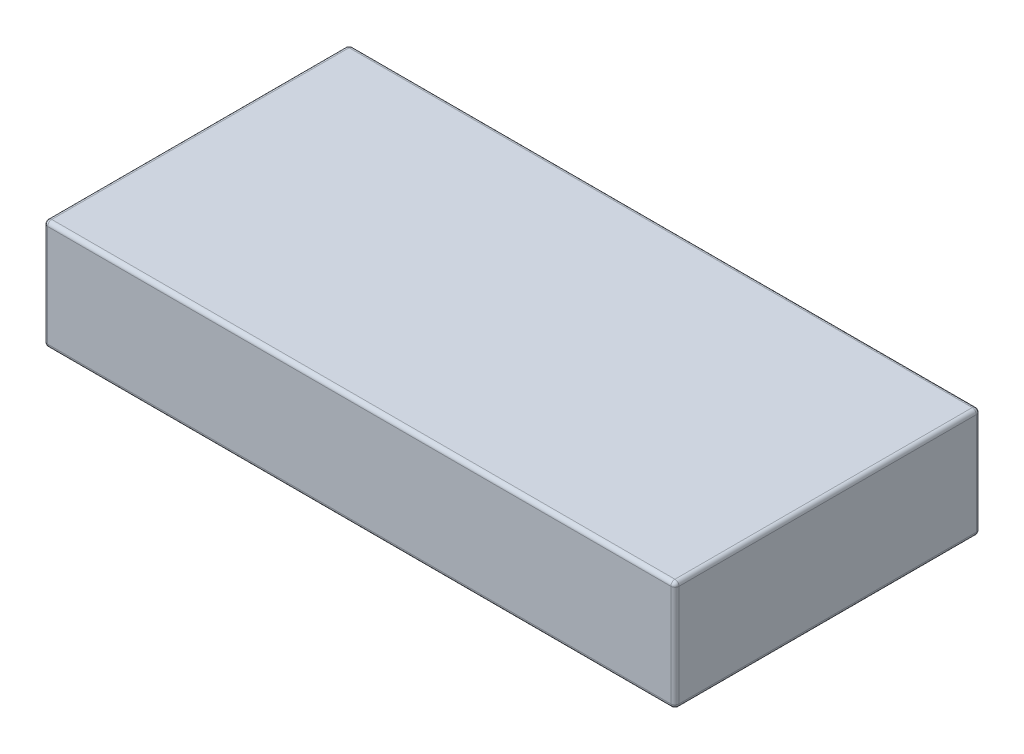
ISO-10303-21;
HEADER;
FILE_DESCRIPTION(('STEP AP214'),'2;1');
FILE_NAME('part.step','',(''),(''),'','','');
FILE_SCHEMA(('AUTOMOTIVE_DESIGN { 1 0 10303 214 1 1 1 1 }'));
ENDSEC;
DATA;
#1=APPLICATION_CONTEXT('core data for automotive mechanical design processes');
#2=APPLICATION_PROTOCOL_DEFINITION('international standard','automotive_design',2000,#1);
#3=PRODUCT_CONTEXT('',#1,'mechanical');
#4=PRODUCT('Part','Part','',(#3));
#5=PRODUCT_RELATED_PRODUCT_CATEGORY('part','',(#4));
#6=PRODUCT_DEFINITION_FORMATION('','',#4);
#7=PRODUCT_DEFINITION_CONTEXT('part definition',#1,'design');
#8=PRODUCT_DEFINITION('design','',#6,#7);
#9=PRODUCT_DEFINITION_SHAPE('','',#8);
#10=(LENGTH_UNIT() NAMED_UNIT(*) SI_UNIT(.MILLI.,.METRE.));
#11=(NAMED_UNIT(*) PLANE_ANGLE_UNIT() SI_UNIT($,.RADIAN.));
#12=(NAMED_UNIT(*) SI_UNIT($,.STERADIAN.) SOLID_ANGLE_UNIT());
#13=UNCERTAINTY_MEASURE_WITH_UNIT(LENGTH_MEASURE(1.E-05),#10,'distance_accuracy_value','');
#14=(GEOMETRIC_REPRESENTATION_CONTEXT(3) GLOBAL_UNCERTAINTY_ASSIGNED_CONTEXT((#13)) GLOBAL_UNIT_ASSIGNED_CONTEXT((#10,
#11,#12)) REPRESENTATION_CONTEXT('',''));
#15=CARTESIAN_POINT('',(0.,0.,0.));
#16=DIRECTION('',(0.,0.,1.));
#17=DIRECTION('',(1.,0.,0.));
#18=AXIS2_PLACEMENT_3D('',#15,#16,#17);
#19=CARTESIAN_POINT('',(77.5,27.,-37.5));
#20=DIRECTION('',(-1.,0.,0.));
#21=DIRECTION('',(0.,0.,1.));
#22=AXIS2_PLACEMENT_3D('',#19,#20,#21);
#23=PLANE('',#22);
#24=DIRECTION('',(0.,-1.,0.));
#25=VECTOR('',#24,1.);
#26=CARTESIAN_POINT('',(77.5,27.,-36.5));
#27=LINE('',#26,#25);
#28=CARTESIAN_POINT('',(77.5,1.,-36.5));
#29=VERTEX_POINT('',#28);
#30=CARTESIAN_POINT('',(77.5,26.,-36.5));
#31=VERTEX_POINT('',#30);
#32=EDGE_CURVE('E140',#29,#31,#27,.F.);
#33=ORIENTED_EDGE('',*,*,#32,.T.);
#34=DIRECTION('',(0.,0.,-1.));
#35=VECTOR('',#34,1.);
#36=CARTESIAN_POINT('',(77.5,26.,37.5));
#37=LINE('',#36,#35);
#38=CARTESIAN_POINT('',(77.5,26.,36.5));
#39=VERTEX_POINT('',#38);
#40=EDGE_CURVE('E186',#31,#39,#37,.F.);
#41=ORIENTED_EDGE('',*,*,#40,.T.);
#42=DIRECTION('',(0.,-1.,0.));
#43=VECTOR('',#42,1.);
#44=CARTESIAN_POINT('',(77.5,27.,36.5));
#45=LINE('',#44,#43);
#46=CARTESIAN_POINT('',(77.5,1.,36.5));
#47=VERTEX_POINT('',#46);
#48=EDGE_CURVE('E181',#39,#47,#45,.T.);
#49=ORIENTED_EDGE('',*,*,#48,.T.);
#50=DIRECTION('',(0.,0.,-1.));
#51=VECTOR('',#50,1.);
#52=CARTESIAN_POINT('',(77.5,1.,-37.5));
#53=LINE('',#52,#51);
#54=EDGE_CURVE('E175',#47,#29,#53,.T.);
#55=ORIENTED_EDGE('',*,*,#54,.T.);
#56=EDGE_LOOP('',(#33,#41,#49,#55));
#57=FACE_BOUND('',#56,.T.);
#58=ADVANCED_FACE('F43',(#57),#23,.F.);
#59=CARTESIAN_POINT('',(-77.5,27.,-37.5));
#60=DIRECTION('',(0.,0.,1.));
#61=DIRECTION('',(1.,0.,0.));
#62=AXIS2_PLACEMENT_3D('',#59,#60,#61);
#63=PLANE('',#62);
#64=DIRECTION('',(0.,-1.,0.));
#65=VECTOR('',#64,1.);
#66=CARTESIAN_POINT('',(-76.5,27.,-37.5));
#67=LINE('',#66,#65);
#68=CARTESIAN_POINT('',(-76.5,1.,-37.5));
#69=VERTEX_POINT('',#68);
#70=CARTESIAN_POINT('',(-76.5,26.,-37.5));
#71=VERTEX_POINT('',#70);
#72=EDGE_CURVE('E165',#69,#71,#67,.F.);
#73=ORIENTED_EDGE('',*,*,#72,.T.);
#74=DIRECTION('',(-1.,0.,0.));
#75=VECTOR('',#74,1.);
#76=CARTESIAN_POINT('',(77.5,26.,-37.5));
#77=LINE('',#76,#75);
#78=CARTESIAN_POINT('',(76.5,26.,-37.5));
#79=VERTEX_POINT('',#78);
#80=EDGE_CURVE('E169',#71,#79,#77,.F.);
#81=ORIENTED_EDGE('',*,*,#80,.T.);
#82=DIRECTION('',(0.,-1.,0.));
#83=VECTOR('',#82,1.);
#84=CARTESIAN_POINT('',(76.5,27.,-37.5));
#85=LINE('',#84,#83);
#86=CARTESIAN_POINT('',(76.5,1.,-37.5));
#87=VERTEX_POINT('',#86);
#88=EDGE_CURVE('E138',#79,#87,#85,.T.);
#89=ORIENTED_EDGE('',*,*,#88,.T.);
#90=DIRECTION('',(-1.,0.,0.));
#91=VECTOR('',#90,1.);
#92=CARTESIAN_POINT('',(-77.5,1.,-37.5));
#93=LINE('',#92,#91);
#94=EDGE_CURVE('E158',#87,#69,#93,.T.);
#95=ORIENTED_EDGE('',*,*,#94,.T.);
#96=EDGE_LOOP('',(#73,#81,#89,#95));
#97=FACE_BOUND('',#96,.T.);
#98=ADVANCED_FACE('F167',(#97),#63,.F.);
#99=CARTESIAN_POINT('',(-77.5,27.,-37.5));
#100=DIRECTION('',(1.,0.,0.));
#101=DIRECTION('',(0.,0.,-1.));
#102=AXIS2_PLACEMENT_3D('',#99,#100,#101);
#103=PLANE('',#102);
#104=DIRECTION('',(0.,-1.,0.));
#105=VECTOR('',#104,1.);
#106=CARTESIAN_POINT('',(-77.5,27.,36.5));
#107=LINE('',#106,#105);
#108=CARTESIAN_POINT('',(-77.5,1.,36.5));
#109=VERTEX_POINT('',#108);
#110=CARTESIAN_POINT('',(-77.5,26.,36.5));
#111=VERTEX_POINT('',#110);
#112=EDGE_CURVE('E192',#109,#111,#107,.F.);
#113=ORIENTED_EDGE('',*,*,#112,.T.);
#114=DIRECTION('',(0.,0.,1.));
#115=VECTOR('',#114,1.);
#116=CARTESIAN_POINT('',(-77.5,26.,-37.5));
#117=LINE('',#116,#115);
#118=CARTESIAN_POINT('',(-77.5,26.,-36.5));
#119=VERTEX_POINT('',#118);
#120=EDGE_CURVE('E199',#111,#119,#117,.F.);
#121=ORIENTED_EDGE('',*,*,#120,.T.);
#122=DIRECTION('',(0.,-1.,0.));
#123=VECTOR('',#122,1.);
#124=CARTESIAN_POINT('',(-77.5,27.,-36.5));
#125=LINE('',#124,#123);
#126=CARTESIAN_POINT('',(-77.5,1.,-36.5));
#127=VERTEX_POINT('',#126);
#128=EDGE_CURVE('E195',#119,#127,#125,.T.);
#129=ORIENTED_EDGE('',*,*,#128,.T.);
#130=DIRECTION('',(0.,0.,1.));
#131=VECTOR('',#130,1.);
#132=CARTESIAN_POINT('',(-77.5,1.,-37.5));
#133=LINE('',#132,#131);
#134=EDGE_CURVE('E189',#127,#109,#133,.T.);
#135=ORIENTED_EDGE('',*,*,#134,.T.);
#136=EDGE_LOOP('',(#113,#121,#129,#135));
#137=FACE_BOUND('',#136,.T.);
#138=ADVANCED_FACE('F338',(#137),#103,.F.);
#139=CARTESIAN_POINT('',(-77.5,27.,37.5));
#140=DIRECTION('',(0.,0.,-1.));
#141=DIRECTION('',(-1.,0.,0.));
#142=AXIS2_PLACEMENT_3D('',#139,#140,#141);
#143=PLANE('',#142);
#144=DIRECTION('',(0.,-1.,0.));
#145=VECTOR('',#144,1.);
#146=CARTESIAN_POINT('',(76.5,27.,37.5));
#147=LINE('',#146,#145);
#148=CARTESIAN_POINT('',(76.5,1.,37.5));
#149=VERTEX_POINT('',#148);
#150=CARTESIAN_POINT('',(76.5,26.,37.5));
#151=VERTEX_POINT('',#150);
#152=EDGE_CURVE('E205',#149,#151,#147,.F.);
#153=ORIENTED_EDGE('',*,*,#152,.T.);
#154=DIRECTION('',(1.,0.,0.));
#155=VECTOR('',#154,1.);
#156=CARTESIAN_POINT('',(-77.5,26.,37.5));
#157=LINE('',#156,#155);
#158=CARTESIAN_POINT('',(-76.5,26.,37.5));
#159=VERTEX_POINT('',#158);
#160=EDGE_CURVE('E212',#151,#159,#157,.F.);
#161=ORIENTED_EDGE('',*,*,#160,.T.);
#162=DIRECTION('',(0.,-1.,0.));
#163=VECTOR('',#162,1.);
#164=CARTESIAN_POINT('',(-76.5,27.,37.5));
#165=LINE('',#164,#163);
#166=CARTESIAN_POINT('',(-76.5,1.,37.5));
#167=VERTEX_POINT('',#166);
#168=EDGE_CURVE('E208',#159,#167,#165,.T.);
#169=ORIENTED_EDGE('',*,*,#168,.T.);
#170=DIRECTION('',(1.,0.,0.));
#171=VECTOR('',#170,1.);
#172=CARTESIAN_POINT('',(-77.5,1.,37.5));
#173=LINE('',#172,#171);
#174=EDGE_CURVE('E202',#167,#149,#173,.T.);
#175=ORIENTED_EDGE('',*,*,#174,.T.);
#176=EDGE_LOOP('',(#153,#161,#169,#175));
#177=FACE_BOUND('',#176,.T.);
#178=ADVANCED_FACE('F349',(#177),#143,.F.);
#179=CARTESIAN_POINT('',(0.,27.,0.));
#180=DIRECTION('',(0.,1.,0.));
#181=DIRECTION('',(0.,0.,1.));
#182=AXIS2_PLACEMENT_3D('',#179,#180,#181);
#183=PLANE('',#182);
#184=DIRECTION('',(0.,0.,1.));
#185=VECTOR('',#184,1.);
#186=CARTESIAN_POINT('',(-76.5,27.,37.5));
#187=LINE('',#186,#185);
#188=CARTESIAN_POINT('',(-76.5,27.,-36.5));
#189=VERTEX_POINT('',#188);
#190=CARTESIAN_POINT('',(-76.5,27.,36.5));
#191=VERTEX_POINT('',#190);
#192=EDGE_CURVE('E221',#189,#191,#187,.T.);
#193=ORIENTED_EDGE('',*,*,#192,.T.);
#194=DIRECTION('',(1.,0.,0.));
#195=VECTOR('',#194,1.);
#196=CARTESIAN_POINT('',(77.5,27.,36.5));
#197=LINE('',#196,#195);
#198=CARTESIAN_POINT('',(76.5,27.,36.5));
#199=VERTEX_POINT('',#198);
#200=EDGE_CURVE('E224',#191,#199,#197,.T.);
#201=ORIENTED_EDGE('',*,*,#200,.T.);
#202=DIRECTION('',(0.,0.,-1.));
#203=VECTOR('',#202,1.);
#204=CARTESIAN_POINT('',(76.5,27.,-37.5));
#205=LINE('',#204,#203);
#206=CARTESIAN_POINT('',(76.5,27.,-36.5));
#207=VERTEX_POINT('',#206);
#208=EDGE_CURVE('E215',#199,#207,#205,.T.);
#209=ORIENTED_EDGE('',*,*,#208,.T.);
#210=DIRECTION('',(-1.,0.,0.));
#211=VECTOR('',#210,1.);
#212=CARTESIAN_POINT('',(-77.5,27.,-36.5));
#213=LINE('',#212,#211);
#214=EDGE_CURVE('E218',#207,#189,#213,.T.);
#215=ORIENTED_EDGE('',*,*,#214,.T.);
#216=EDGE_LOOP('',(#193,#201,#209,#215));
#217=FACE_BOUND('',#216,.T.);
#218=ADVANCED_FACE('F330',(#217),#183,.T.);
#219=CARTESIAN_POINT('',(0.,0.,0.));
#220=DIRECTION('',(0.,1.,0.));
#221=DIRECTION('',(0.,0.,1.));
#222=AXIS2_PLACEMENT_3D('',#219,#220,#221);
#223=PLANE('',#222);
#224=DIRECTION('',(0.,0.,1.));
#225=VECTOR('',#224,1.);
#226=CARTESIAN_POINT('',(-76.5,0.,0.));
#227=LINE('',#226,#225);
#228=CARTESIAN_POINT('',(-76.5,0.,36.5));
#229=VERTEX_POINT('',#228);
#230=CARTESIAN_POINT('',(-76.5,0.,-36.5));
#231=VERTEX_POINT('',#230);
#232=EDGE_CURVE('E53',#229,#231,#227,.F.);
#233=ORIENTED_EDGE('',*,*,#232,.T.);
#234=DIRECTION('',(-1.,0.,0.));
#235=VECTOR('',#234,1.);
#236=CARTESIAN_POINT('',(0.,0.,-36.5));
#237=LINE('',#236,#235);
#238=CARTESIAN_POINT('',(76.5,0.,-36.5));
#239=VERTEX_POINT('',#238);
#240=EDGE_CURVE('E11',#231,#239,#237,.F.);
#241=ORIENTED_EDGE('',*,*,#240,.T.);
#242=DIRECTION('',(0.,0.,-1.));
#243=VECTOR('',#242,1.);
#244=CARTESIAN_POINT('',(76.5,0.,0.));
#245=LINE('',#244,#243);
#246=CARTESIAN_POINT('',(76.5,0.,36.5));
#247=VERTEX_POINT('',#246);
#248=EDGE_CURVE('E228',#239,#247,#245,.F.);
#249=ORIENTED_EDGE('',*,*,#248,.T.);
#250=DIRECTION('',(1.,0.,0.));
#251=VECTOR('',#250,1.);
#252=CARTESIAN_POINT('',(0.,0.,36.5));
#253=LINE('',#252,#251);
#254=EDGE_CURVE('E64',#247,#229,#253,.F.);
#255=ORIENTED_EDGE('',*,*,#254,.T.);
#256=EDGE_LOOP('',(#233,#241,#249,#255));
#257=FACE_BOUND('',#256,.T.);
#258=ADVANCED_FACE('F575',(#257),#223,.F.);
#259=CARTESIAN_POINT('',(-76.5,27.,36.5));
#260=DIRECTION('',(0.,-1.,0.));
#261=DIRECTION('',(0.,0.,-1.));
#262=AXIS2_PLACEMENT_3D('',#259,#260,#261);
#263=CYLINDRICAL_SURFACE('',#262,1.);
#264=CARTESIAN_POINT('',(-76.5,26.,36.5));
#265=DIRECTION('',(0.,1.,0.));
#266=DIRECTION('',(0.,0.,1.));
#267=AXIS2_PLACEMENT_3D('',#264,#265,#266);
#268=CIRCLE('',#267,1.);
#269=EDGE_CURVE('E47',#111,#159,#268,.T.);
#270=ORIENTED_EDGE('',*,*,#269,.F.);
#271=ORIENTED_EDGE('',*,*,#112,.F.);
#272=CARTESIAN_POINT('',(-76.5,1.,36.5));
#273=DIRECTION('',(0.,-1.,0.));
#274=DIRECTION('',(0.,0.,-1.));
#275=AXIS2_PLACEMENT_3D('',#272,#273,#274);
#276=CIRCLE('',#275,1.);
#277=EDGE_CURVE('E305',#167,#109,#276,.T.);
#278=ORIENTED_EDGE('',*,*,#277,.F.);
#279=ORIENTED_EDGE('',*,*,#168,.F.);
#280=EDGE_LOOP('',(#270,#271,#278,#279));
#281=FACE_BOUND('',#280,.T.);
#282=ADVANCED_FACE('F45',(#281),#263,.T.);
#283=CARTESIAN_POINT('',(-76.5,26.,36.5));
#284=DIRECTION('',(0.,0.,1.));
#285=DIRECTION('',(1.,0.,0.));
#286=AXIS2_PLACEMENT_3D('',#283,#284,#285);
#287=SPHERICAL_SURFACE('',#286,1.);
#288=CARTESIAN_POINT('',(-76.5,26.,36.5));
#289=DIRECTION('',(0.,0.,1.));
#290=DIRECTION('',(1.,0.,0.));
#291=AXIS2_PLACEMENT_3D('',#288,#289,#290);
#292=CIRCLE('',#291,1.);
#293=EDGE_CURVE('E298',#111,#191,#292,.F.);
#294=ORIENTED_EDGE('',*,*,#293,.F.);
#295=ORIENTED_EDGE('',*,*,#269,.T.);
#296=CARTESIAN_POINT('',(-76.5,26.,36.5));
#297=DIRECTION('',(-1.,0.,0.));
#298=DIRECTION('',(0.,-1.,0.));
#299=AXIS2_PLACEMENT_3D('',#296,#297,#298);
#300=CIRCLE('',#299,1.);
#301=EDGE_CURVE('E302',#191,#159,#300,.F.);
#302=ORIENTED_EDGE('',*,*,#301,.F.);
#303=EDGE_LOOP('',(#294,#295,#302));
#304=FACE_BOUND('',#303,.T.);
#305=ADVANCED_FACE('F318',(#304),#287,.T.);
#306=CARTESIAN_POINT('',(-76.5,1.,36.5));
#307=DIRECTION('',(-1.,0.,0.));
#308=DIRECTION('',(0.,-1.,0.));
#309=AXIS2_PLACEMENT_3D('',#306,#307,#308);
#310=SPHERICAL_SURFACE('',#309,1.);
#311=CARTESIAN_POINT('',(-76.5,1.,36.5));
#312=DIRECTION('',(-1.,0.,0.));
#313=DIRECTION('',(0.,0.,1.));
#314=AXIS2_PLACEMENT_3D('',#311,#312,#313);
#315=CIRCLE('',#314,1.);
#316=EDGE_CURVE('E291',#167,#229,#315,.F.);
#317=ORIENTED_EDGE('',*,*,#316,.F.);
#318=ORIENTED_EDGE('',*,*,#277,.T.);
#319=CARTESIAN_POINT('',(-76.5,1.,36.5));
#320=DIRECTION('',(0.,0.,1.));
#321=DIRECTION('',(1.,0.,0.));
#322=AXIS2_PLACEMENT_3D('',#319,#320,#321);
#323=CIRCLE('',#322,1.);
#324=EDGE_CURVE('E294',#229,#109,#323,.F.);
#325=ORIENTED_EDGE('',*,*,#324,.F.);
#326=EDGE_LOOP('',(#317,#318,#325));
#327=FACE_BOUND('',#326,.T.);
#328=ADVANCED_FACE('F548',(#327),#310,.T.);
#329=CARTESIAN_POINT('',(0.,26.,36.5));
#330=DIRECTION('',(-1.,0.,0.));
#331=DIRECTION('',(0.,0.,1.));
#332=AXIS2_PLACEMENT_3D('',#329,#330,#331);
#333=CYLINDRICAL_SURFACE('',#332,1.);
#334=ORIENTED_EDGE('',*,*,#301,.T.);
#335=ORIENTED_EDGE('',*,*,#160,.F.);
#336=CARTESIAN_POINT('',(76.5,26.,36.5));
#337=DIRECTION('',(1.,0.,0.));
#338=DIRECTION('',(0.,0.,-1.));
#339=AXIS2_PLACEMENT_3D('',#336,#337,#338);
#340=CIRCLE('',#339,1.);
#341=EDGE_CURVE('E283',#199,#151,#340,.T.);
#342=ORIENTED_EDGE('',*,*,#341,.F.);
#343=ORIENTED_EDGE('',*,*,#200,.F.);
#344=EDGE_LOOP('',(#334,#335,#342,#343));
#345=FACE_BOUND('',#344,.T.);
#346=ADVANCED_FACE('F326',(#345),#333,.T.);
#347=CARTESIAN_POINT('',(-76.5,26.,0.));
#348=DIRECTION('',(0.,0.,-1.));
#349=DIRECTION('',(-1.,0.,0.));
#350=AXIS2_PLACEMENT_3D('',#347,#348,#349);
#351=CYLINDRICAL_SURFACE('',#350,1.);
#352=ORIENTED_EDGE('',*,*,#293,.T.);
#353=ORIENTED_EDGE('',*,*,#192,.F.);
#354=CARTESIAN_POINT('',(-76.5,26.,-36.5));
#355=DIRECTION('',(0.,0.,-1.));
#356=DIRECTION('',(-1.,0.,0.));
#357=AXIS2_PLACEMENT_3D('',#354,#355,#356);
#358=CIRCLE('',#357,1.);
#359=EDGE_CURVE('E279',#119,#189,#358,.T.);
#360=ORIENTED_EDGE('',*,*,#359,.F.);
#361=ORIENTED_EDGE('',*,*,#120,.F.);
#362=EDGE_LOOP('',(#352,#353,#360,#361));
#363=FACE_BOUND('',#362,.T.);
#364=ADVANCED_FACE('F335',(#363),#351,.T.);
#365=CARTESIAN_POINT('',(-76.5,27.,-36.5));
#366=DIRECTION('',(0.,-1.,0.));
#367=DIRECTION('',(0.,0.,-1.));
#368=AXIS2_PLACEMENT_3D('',#365,#366,#367);
#369=CYLINDRICAL_SURFACE('',#368,1.);
#370=CARTESIAN_POINT('',(-76.5,1.,-36.5));
#371=DIRECTION('',(0.,-1.,0.));
#372=DIRECTION('',(0.,0.,-1.));
#373=AXIS2_PLACEMENT_3D('',#370,#371,#372);
#374=CIRCLE('',#373,1.);
#375=EDGE_CURVE('E271',#127,#69,#374,.T.);
#376=ORIENTED_EDGE('',*,*,#375,.F.);
#377=ORIENTED_EDGE('',*,*,#128,.F.);
#378=CARTESIAN_POINT('',(-76.5,26.,-36.5));
#379=DIRECTION('',(0.,1.,0.));
#380=DIRECTION('',(0.,0.,1.));
#381=AXIS2_PLACEMENT_3D('',#378,#379,#380);
#382=CIRCLE('',#381,1.);
#383=EDGE_CURVE('E275',#71,#119,#382,.T.);
#384=ORIENTED_EDGE('',*,*,#383,.F.);
#385=ORIENTED_EDGE('',*,*,#72,.F.);
#386=EDGE_LOOP('',(#376,#377,#384,#385));
#387=FACE_BOUND('',#386,.T.);
#388=ADVANCED_FACE('F342',(#387),#369,.T.);
#389=CARTESIAN_POINT('',(-76.5,1.,-37.5));
#390=DIRECTION('',(0.,0.,1.));
#391=DIRECTION('',(1.,0.,0.));
#392=AXIS2_PLACEMENT_3D('',#389,#390,#391);
#393=CYLINDRICAL_SURFACE('',#392,1.);
#394=ORIENTED_EDGE('',*,*,#324,.T.);
#395=ORIENTED_EDGE('',*,*,#134,.F.);
#396=CARTESIAN_POINT('',(-76.5,1.,-36.5));
#397=DIRECTION('',(0.,0.,-1.));
#398=DIRECTION('',(-1.,0.,0.));
#399=AXIS2_PLACEMENT_3D('',#396,#397,#398);
#400=CIRCLE('',#399,1.);
#401=EDGE_CURVE('E268',#231,#127,#400,.T.);
#402=ORIENTED_EDGE('',*,*,#401,.F.);
#403=ORIENTED_EDGE('',*,*,#232,.F.);
#404=EDGE_LOOP('',(#394,#395,#402,#403));
#405=FACE_BOUND('',#404,.T.);
#406=ADVANCED_FACE('F347',(#405),#393,.T.);
#407=CARTESIAN_POINT('',(-77.5,1.,36.5));
#408=DIRECTION('',(1.,0.,0.));
#409=DIRECTION('',(0.,0.,-1.));
#410=AXIS2_PLACEMENT_3D('',#407,#408,#409);
#411=CYLINDRICAL_SURFACE('',#410,1.);
#412=ORIENTED_EDGE('',*,*,#316,.T.);
#413=ORIENTED_EDGE('',*,*,#254,.F.);
#414=CARTESIAN_POINT('',(76.5,1.,36.5));
#415=DIRECTION('',(1.,0.,0.));
#416=DIRECTION('',(0.,0.,-1.));
#417=AXIS2_PLACEMENT_3D('',#414,#415,#416);
#418=CIRCLE('',#417,1.);
#419=EDGE_CURVE('E264',#149,#247,#418,.T.);
#420=ORIENTED_EDGE('',*,*,#419,.F.);
#421=ORIENTED_EDGE('',*,*,#174,.F.);
#422=EDGE_LOOP('',(#412,#413,#420,#421));
#423=FACE_BOUND('',#422,.T.);
#424=ADVANCED_FACE('F358',(#423),#411,.T.);
#425=CARTESIAN_POINT('',(76.5,27.,36.5));
#426=DIRECTION('',(0.,-1.,0.));
#427=DIRECTION('',(0.,0.,-1.));
#428=AXIS2_PLACEMENT_3D('',#425,#426,#427);
#429=CYLINDRICAL_SURFACE('',#428,1.);
#430=CARTESIAN_POINT('',(76.5,26.,36.5));
#431=DIRECTION('',(0.,1.,0.));
#432=DIRECTION('',(0.,0.,1.));
#433=AXIS2_PLACEMENT_3D('',#430,#431,#432);
#434=CIRCLE('',#433,1.);
#435=EDGE_CURVE('E287',#151,#39,#434,.T.);
#436=ORIENTED_EDGE('',*,*,#435,.F.);
#437=ORIENTED_EDGE('',*,*,#152,.F.);
#438=CARTESIAN_POINT('',(76.5,1.,36.5));
#439=DIRECTION('',(0.,-1.,0.));
#440=DIRECTION('',(0.,0.,-1.));
#441=AXIS2_PLACEMENT_3D('',#438,#439,#440);
#442=CIRCLE('',#441,1.);
#443=EDGE_CURVE('E260',#47,#149,#442,.T.);
#444=ORIENTED_EDGE('',*,*,#443,.F.);
#445=ORIENTED_EDGE('',*,*,#48,.F.);
#446=EDGE_LOOP('',(#436,#437,#444,#445));
#447=FACE_BOUND('',#446,.T.);
#448=ADVANCED_FACE('F354',(#447),#429,.T.);
#449=CARTESIAN_POINT('',(76.5,26.,36.5));
#450=DIRECTION('',(0.,0.,1.));
#451=DIRECTION('',(1.,0.,0.));
#452=AXIS2_PLACEMENT_3D('',#449,#450,#451);
#453=SPHERICAL_SURFACE('',#452,1.);
#454=ORIENTED_EDGE('',*,*,#341,.T.);
#455=ORIENTED_EDGE('',*,*,#435,.T.);
#456=CARTESIAN_POINT('',(76.5,26.,36.5));
#457=DIRECTION('',(0.,0.,1.));
#458=DIRECTION('',(1.,0.,0.));
#459=AXIS2_PLACEMENT_3D('',#456,#457,#458);
#460=CIRCLE('',#459,1.);
#461=EDGE_CURVE('E256',#199,#39,#460,.F.);
#462=ORIENTED_EDGE('',*,*,#461,.F.);
#463=EDGE_LOOP('',(#454,#455,#462));
#464=FACE_BOUND('',#463,.T.);
#465=ADVANCED_FACE('F368',(#464),#453,.T.);
#466=CARTESIAN_POINT('',(-76.5,26.,-36.5));
#467=DIRECTION('',(-1.,0.,0.));
#468=DIRECTION('',(0.,0.,1.));
#469=AXIS2_PLACEMENT_3D('',#466,#467,#468);
#470=SPHERICAL_SURFACE('',#469,1.);
#471=ORIENTED_EDGE('',*,*,#383,.T.);
#472=ORIENTED_EDGE('',*,*,#359,.T.);
#473=CARTESIAN_POINT('',(-76.5,26.,-36.5));
#474=DIRECTION('',(-1.,0.,0.));
#475=DIRECTION('',(0.,0.,1.));
#476=AXIS2_PLACEMENT_3D('',#473,#474,#475);
#477=CIRCLE('',#476,1.);
#478=EDGE_CURVE('E252',#71,#189,#477,.F.);
#479=ORIENTED_EDGE('',*,*,#478,.F.);
#480=EDGE_LOOP('',(#471,#472,#479));
#481=FACE_BOUND('',#480,.T.);
#482=ADVANCED_FACE('F378',(#481),#470,.T.);
#483=CARTESIAN_POINT('',(-76.5,1.,-36.5));
#484=DIRECTION('',(-1.,0.,0.));
#485=DIRECTION('',(0.,-1.,0.));
#486=AXIS2_PLACEMENT_3D('',#483,#484,#485);
#487=SPHERICAL_SURFACE('',#486,1.);
#488=ORIENTED_EDGE('',*,*,#401,.T.);
#489=ORIENTED_EDGE('',*,*,#375,.T.);
#490=CARTESIAN_POINT('',(-76.5,1.,-36.5));
#491=DIRECTION('',(-1.,0.,0.));
#492=DIRECTION('',(0.,0.,1.));
#493=AXIS2_PLACEMENT_3D('',#490,#491,#492);
#494=CIRCLE('',#493,1.);
#495=EDGE_CURVE('E161',#231,#69,#494,.F.);
#496=ORIENTED_EDGE('',*,*,#495,.F.);
#497=EDGE_LOOP('',(#488,#489,#496));
#498=FACE_BOUND('',#497,.T.);
#499=ADVANCED_FACE('F380',(#498),#487,.T.);
#500=CARTESIAN_POINT('',(76.5,1.,36.5));
#501=DIRECTION('',(0.,0.,1.));
#502=DIRECTION('',(0.,-1.,0.));
#503=AXIS2_PLACEMENT_3D('',#500,#501,#502);
#504=SPHERICAL_SURFACE('',#503,1.);
#505=ORIENTED_EDGE('',*,*,#443,.T.);
#506=ORIENTED_EDGE('',*,*,#419,.T.);
#507=CARTESIAN_POINT('',(76.5,1.,36.5));
#508=DIRECTION('',(0.,0.,1.));
#509=DIRECTION('',(1.,0.,0.));
#510=AXIS2_PLACEMENT_3D('',#507,#508,#509);
#511=CIRCLE('',#510,1.);
#512=EDGE_CURVE('E246',#47,#247,#511,.F.);
#513=ORIENTED_EDGE('',*,*,#512,.F.);
#514=EDGE_LOOP('',(#505,#506,#513));
#515=FACE_BOUND('',#514,.T.);
#516=ADVANCED_FACE('F360',(#515),#504,.T.);
#517=CARTESIAN_POINT('',(76.5,26.,0.));
#518=DIRECTION('',(0.,0.,1.));
#519=DIRECTION('',(1.,0.,0.));
#520=AXIS2_PLACEMENT_3D('',#517,#518,#519);
#521=CYLINDRICAL_SURFACE('',#520,1.);
#522=ORIENTED_EDGE('',*,*,#461,.T.);
#523=ORIENTED_EDGE('',*,*,#40,.F.);
#524=CARTESIAN_POINT('',(76.5,26.,-36.5));
#525=DIRECTION('',(0.,0.,-1.));
#526=DIRECTION('',(-1.,0.,0.));
#527=AXIS2_PLACEMENT_3D('',#524,#525,#526);
#528=CIRCLE('',#527,1.);
#529=EDGE_CURVE('E242',#207,#31,#528,.T.);
#530=ORIENTED_EDGE('',*,*,#529,.F.);
#531=ORIENTED_EDGE('',*,*,#208,.F.);
#532=EDGE_LOOP('',(#522,#523,#530,#531));
#533=FACE_BOUND('',#532,.T.);
#534=ADVANCED_FACE('F370',(#533),#521,.T.);
#535=CARTESIAN_POINT('',(0.,26.,-36.5));
#536=DIRECTION('',(1.,0.,0.));
#537=DIRECTION('',(0.,0.,-1.));
#538=AXIS2_PLACEMENT_3D('',#535,#536,#537);
#539=CYLINDRICAL_SURFACE('',#538,1.);
#540=ORIENTED_EDGE('',*,*,#478,.T.);
#541=ORIENTED_EDGE('',*,*,#214,.F.);
#542=CARTESIAN_POINT('',(76.5,26.,-36.5));
#543=DIRECTION('',(1.,0.,0.));
#544=DIRECTION('',(0.,0.,-1.));
#545=AXIS2_PLACEMENT_3D('',#542,#543,#544);
#546=CIRCLE('',#545,1.);
#547=EDGE_CURVE('E155',#79,#207,#546,.T.);
#548=ORIENTED_EDGE('',*,*,#547,.F.);
#549=ORIENTED_EDGE('',*,*,#80,.F.);
#550=EDGE_LOOP('',(#540,#541,#548,#549));
#551=FACE_BOUND('',#550,.T.);
#552=ADVANCED_FACE('F376',(#551),#539,.T.);
#553=CARTESIAN_POINT('',(-77.5,1.,-36.5));
#554=DIRECTION('',(-1.,0.,0.));
#555=DIRECTION('',(0.,0.,1.));
#556=AXIS2_PLACEMENT_3D('',#553,#554,#555);
#557=CYLINDRICAL_SURFACE('',#556,1.);
#558=ORIENTED_EDGE('',*,*,#495,.T.);
#559=ORIENTED_EDGE('',*,*,#94,.F.);
#560=CARTESIAN_POINT('',(76.5,1.,-36.5));
#561=DIRECTION('',(1.,0.,0.));
#562=DIRECTION('',(0.,0.,-1.));
#563=AXIS2_PLACEMENT_3D('',#560,#561,#562);
#564=CIRCLE('',#563,1.);
#565=EDGE_CURVE('E146',#239,#87,#564,.T.);
#566=ORIENTED_EDGE('',*,*,#565,.F.);
#567=ORIENTED_EDGE('',*,*,#240,.F.);
#568=EDGE_LOOP('',(#558,#559,#566,#567));
#569=FACE_BOUND('',#568,.T.);
#570=ADVANCED_FACE('F159',(#569),#557,.T.);
#571=CARTESIAN_POINT('',(76.5,1.,-37.5));
#572=DIRECTION('',(0.,0.,-1.));
#573=DIRECTION('',(-1.,0.,0.));
#574=AXIS2_PLACEMENT_3D('',#571,#572,#573);
#575=CYLINDRICAL_SURFACE('',#574,1.);
#576=ORIENTED_EDGE('',*,*,#512,.T.);
#577=ORIENTED_EDGE('',*,*,#248,.F.);
#578=CARTESIAN_POINT('',(76.5,1.,-36.5));
#579=DIRECTION('',(0.,0.,-1.));
#580=DIRECTION('',(-1.,0.,0.));
#581=AXIS2_PLACEMENT_3D('',#578,#579,#580);
#582=CIRCLE('',#581,1.);
#583=EDGE_CURVE('E150',#29,#239,#582,.T.);
#584=ORIENTED_EDGE('',*,*,#583,.F.);
#585=ORIENTED_EDGE('',*,*,#54,.F.);
#586=EDGE_LOOP('',(#576,#577,#584,#585));
#587=FACE_BOUND('',#586,.T.);
#588=ADVANCED_FACE('F363',(#587),#575,.T.);
#589=CARTESIAN_POINT('',(76.5,26.,-36.5));
#590=DIRECTION('',(0.,1.,0.));
#591=DIRECTION('',(0.,0.,1.));
#592=AXIS2_PLACEMENT_3D('',#589,#590,#591);
#593=SPHERICAL_SURFACE('',#592,1.);
#594=ORIENTED_EDGE('',*,*,#547,.T.);
#595=ORIENTED_EDGE('',*,*,#529,.T.);
#596=CARTESIAN_POINT('',(76.5,26.,-36.5));
#597=DIRECTION('',(0.,1.,0.));
#598=DIRECTION('',(0.,0.,1.));
#599=AXIS2_PLACEMENT_3D('',#596,#597,#598);
#600=CIRCLE('',#599,1.);
#601=EDGE_CURVE('E143',#79,#31,#600,.F.);
#602=ORIENTED_EDGE('',*,*,#601,.F.);
#603=EDGE_LOOP('',(#594,#595,#602));
#604=FACE_BOUND('',#603,.T.);
#605=ADVANCED_FACE('F374',(#604),#593,.T.);
#606=CARTESIAN_POINT('',(76.5,1.,-36.5));
#607=DIRECTION('',(0.,-1.,0.));
#608=DIRECTION('',(0.,0.,-1.));
#609=AXIS2_PLACEMENT_3D('',#606,#607,#608);
#610=SPHERICAL_SURFACE('',#609,1.);
#611=ORIENTED_EDGE('',*,*,#583,.T.);
#612=ORIENTED_EDGE('',*,*,#565,.T.);
#613=CARTESIAN_POINT('',(76.5,1.,-36.5));
#614=DIRECTION('',(0.,-1.,0.));
#615=DIRECTION('',(0.,0.,-1.));
#616=AXIS2_PLACEMENT_3D('',#613,#614,#615);
#617=CIRCLE('',#616,1.);
#618=EDGE_CURVE('E134',#29,#87,#617,.F.);
#619=ORIENTED_EDGE('',*,*,#618,.F.);
#620=EDGE_LOOP('',(#611,#612,#619));
#621=FACE_BOUND('',#620,.T.);
#622=ADVANCED_FACE('F148',(#621),#610,.T.);
#623=CARTESIAN_POINT('',(76.5,27.,-36.5));
#624=DIRECTION('',(0.,-1.,0.));
#625=DIRECTION('',(0.,0.,-1.));
#626=AXIS2_PLACEMENT_3D('',#623,#624,#625);
#627=CYLINDRICAL_SURFACE('',#626,1.);
#628=ORIENTED_EDGE('',*,*,#601,.T.);
#629=ORIENTED_EDGE('',*,*,#32,.F.);
#630=ORIENTED_EDGE('',*,*,#618,.T.);
#631=ORIENTED_EDGE('',*,*,#88,.F.);
#632=EDGE_LOOP('',(#628,#629,#630,#631));
#633=FACE_BOUND('',#632,.T.);
#634=ADVANCED_FACE('F136',(#633),#627,.T.);
#635=CLOSED_SHELL('',(#58,#98,#138,#178,#218,#258,#282,#305,#328,#346,#364,#388,#406,#424,#448,
#465,#482,#499,#516,#534,#552,#570,#588,#605,#622,#634));
#636=MANIFOLD_SOLID_BREP('B2',#635);
#637=ADVANCED_BREP_SHAPE_REPRESENTATION('',(#18,#636),#14);
#638=SHAPE_DEFINITION_REPRESENTATION(#9,#637);
ENDSEC;
END-ISO-10303-21;
